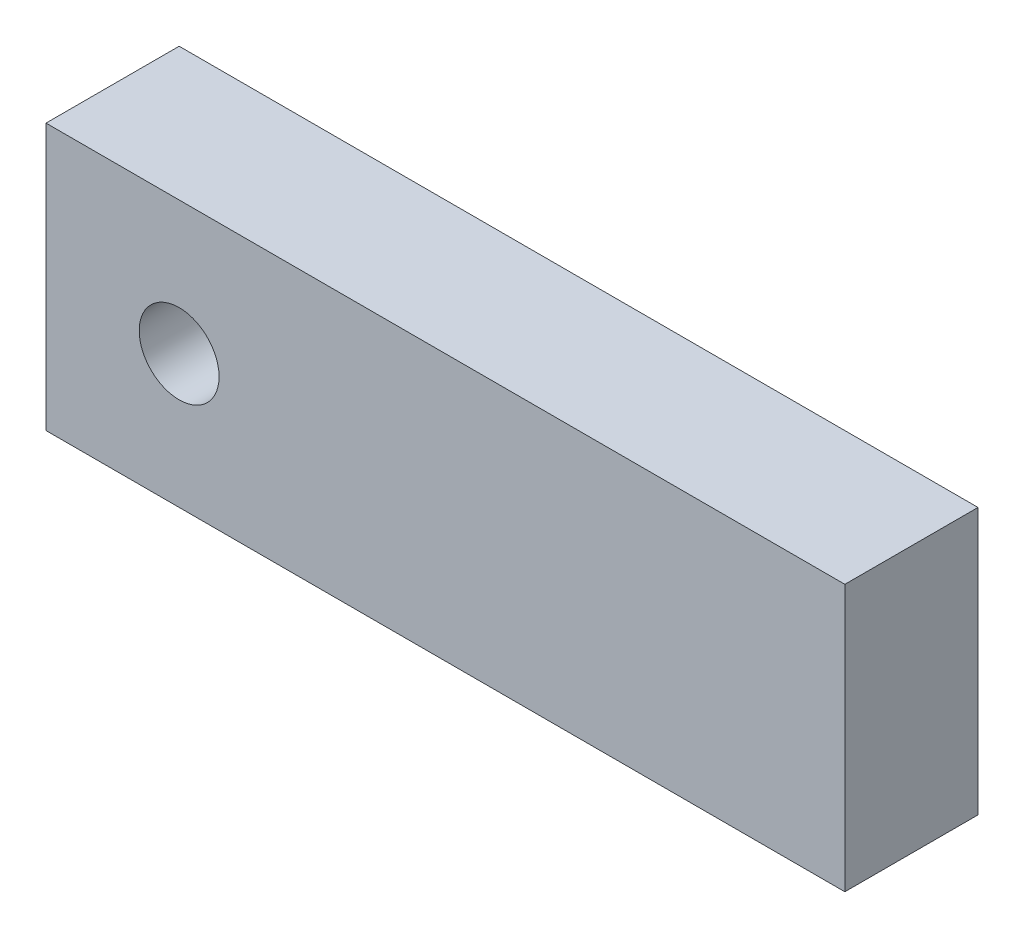
ISO-10303-21;
HEADER;
FILE_DESCRIPTION(('STEP AP214'),'2;1');
FILE_NAME('part.step','',(''),(''),'','','');
FILE_SCHEMA(('AUTOMOTIVE_DESIGN { 1 0 10303 214 1 1 1 1 }'));
ENDSEC;
DATA;
#1=APPLICATION_CONTEXT('core data for automotive mechanical design processes');
#2=APPLICATION_PROTOCOL_DEFINITION('international standard','automotive_design',2000,#1);
#3=PRODUCT_CONTEXT('',#1,'mechanical');
#4=PRODUCT('Part','Part','',(#3));
#5=PRODUCT_RELATED_PRODUCT_CATEGORY('part','',(#4));
#6=PRODUCT_DEFINITION_FORMATION('','',#4);
#7=PRODUCT_DEFINITION_CONTEXT('part definition',#1,'design');
#8=PRODUCT_DEFINITION('design','',#6,#7);
#9=PRODUCT_DEFINITION_SHAPE('','',#8);
#10=(LENGTH_UNIT() NAMED_UNIT(*) SI_UNIT(.MILLI.,.METRE.));
#11=(NAMED_UNIT(*) PLANE_ANGLE_UNIT() SI_UNIT($,.RADIAN.));
#12=(NAMED_UNIT(*) SI_UNIT($,.STERADIAN.) SOLID_ANGLE_UNIT());
#13=UNCERTAINTY_MEASURE_WITH_UNIT(LENGTH_MEASURE(1.E-05),#10,'distance_accuracy_value','');
#14=(GEOMETRIC_REPRESENTATION_CONTEXT(3) GLOBAL_UNCERTAINTY_ASSIGNED_CONTEXT((#13)) GLOBAL_UNIT_ASSIGNED_CONTEXT((#10,
#11,#12)) REPRESENTATION_CONTEXT('',''));
#15=CARTESIAN_POINT('',(0.,0.,0.));
#16=DIRECTION('',(0.,0.,1.));
#17=DIRECTION('',(1.,0.,0.));
#18=AXIS2_PLACEMENT_3D('',#15,#16,#17);
#19=CARTESIAN_POINT('',(15.,5.,5.));
#20=DIRECTION('',(-1.,0.,0.));
#21=DIRECTION('',(0.,-1.,0.));
#22=AXIS2_PLACEMENT_3D('',#19,#20,#21);
#23=PLANE('',#22);
#24=DIRECTION('',(0.,1.,0.));
#25=VECTOR('',#24,1.);
#26=CARTESIAN_POINT('',(15.,5.,0.));
#27=LINE('',#26,#25);
#28=CARTESIAN_POINT('',(15.,-5.,0.));
#29=VERTEX_POINT('',#28);
#30=CARTESIAN_POINT('',(15.,5.,0.));
#31=VERTEX_POINT('',#30);
#32=EDGE_CURVE('E94',#29,#31,#27,.T.);
#33=ORIENTED_EDGE('',*,*,#32,.T.);
#34=DIRECTION('',(0.,0.,-1.));
#35=VECTOR('',#34,1.);
#36=CARTESIAN_POINT('',(15.,5.,5.));
#37=LINE('',#36,#35);
#38=CARTESIAN_POINT('',(15.,5.,5.));
#39=VERTEX_POINT('',#38);
#40=EDGE_CURVE('E11',#39,#31,#37,.T.);
#41=ORIENTED_EDGE('',*,*,#40,.F.);
#42=DIRECTION('',(0.,1.,0.));
#43=VECTOR('',#42,1.);
#44=CARTESIAN_POINT('',(15.,5.,5.));
#45=LINE('',#44,#43);
#46=CARTESIAN_POINT('',(15.,-5.,5.));
#47=VERTEX_POINT('',#46);
#48=EDGE_CURVE('E82',#47,#39,#45,.T.);
#49=ORIENTED_EDGE('',*,*,#48,.F.);
#50=DIRECTION('',(0.,0.,-1.));
#51=VECTOR('',#50,1.);
#52=CARTESIAN_POINT('',(15.,-5.,5.));
#53=LINE('',#52,#51);
#54=EDGE_CURVE('E90',#47,#29,#53,.T.);
#55=ORIENTED_EDGE('',*,*,#54,.T.);
#56=EDGE_LOOP('',(#33,#41,#49,#55));
#57=FACE_BOUND('',#56,.T.);
#58=ADVANCED_FACE('F31',(#57),#23,.F.);
#59=CARTESIAN_POINT('',(-15.,5.,5.));
#60=DIRECTION('',(0.,-1.,0.));
#61=DIRECTION('',(0.,0.,-1.));
#62=AXIS2_PLACEMENT_3D('',#59,#60,#61);
#63=PLANE('',#62);
#64=DIRECTION('',(-1.,0.,0.));
#65=VECTOR('',#64,1.);
#66=CARTESIAN_POINT('',(-15.,5.,0.));
#67=LINE('',#66,#65);
#68=CARTESIAN_POINT('',(-15.,5.,0.));
#69=VERTEX_POINT('',#68);
#70=EDGE_CURVE('E86',#31,#69,#67,.T.);
#71=ORIENTED_EDGE('',*,*,#70,.T.);
#72=DIRECTION('',(0.,0.,-1.));
#73=VECTOR('',#72,1.);
#74=CARTESIAN_POINT('',(-15.,5.,5.));
#75=LINE('',#74,#73);
#76=CARTESIAN_POINT('',(-15.,5.,5.));
#77=VERTEX_POINT('',#76);
#78=EDGE_CURVE('E39',#77,#69,#75,.T.);
#79=ORIENTED_EDGE('',*,*,#78,.F.);
#80=DIRECTION('',(-1.,0.,0.));
#81=VECTOR('',#80,1.);
#82=CARTESIAN_POINT('',(-15.,5.,5.));
#83=LINE('',#82,#81);
#84=EDGE_CURVE('E77',#39,#77,#83,.T.);
#85=ORIENTED_EDGE('',*,*,#84,.F.);
#86=ORIENTED_EDGE('',*,*,#40,.T.);
#87=EDGE_LOOP('',(#71,#79,#85,#86));
#88=FACE_BOUND('',#87,.T.);
#89=ADVANCED_FACE('F85',(#88),#63,.F.);
#90=CARTESIAN_POINT('',(-15.,5.,5.));
#91=DIRECTION('',(1.,0.,0.));
#92=DIRECTION('',(0.,1.,0.));
#93=AXIS2_PLACEMENT_3D('',#90,#91,#92);
#94=PLANE('',#93);
#95=DIRECTION('',(0.,-1.,0.));
#96=VECTOR('',#95,1.);
#97=CARTESIAN_POINT('',(-15.,5.,0.));
#98=LINE('',#97,#96);
#99=CARTESIAN_POINT('',(-15.,-5.,0.));
#100=VERTEX_POINT('',#99);
#101=EDGE_CURVE('E64',#69,#100,#98,.T.);
#102=ORIENTED_EDGE('',*,*,#101,.T.);
#103=DIRECTION('',(0.,0.,-1.));
#104=VECTOR('',#103,1.);
#105=CARTESIAN_POINT('',(-15.,-5.,5.));
#106=LINE('',#105,#104);
#107=CARTESIAN_POINT('',(-15.,-5.,5.));
#108=VERTEX_POINT('',#107);
#109=EDGE_CURVE('E87',#108,#100,#106,.T.);
#110=ORIENTED_EDGE('',*,*,#109,.F.);
#111=DIRECTION('',(0.,-1.,0.));
#112=VECTOR('',#111,1.);
#113=CARTESIAN_POINT('',(-15.,5.,5.));
#114=LINE('',#113,#112);
#115=EDGE_CURVE('E80',#77,#108,#114,.T.);
#116=ORIENTED_EDGE('',*,*,#115,.F.);
#117=ORIENTED_EDGE('',*,*,#78,.T.);
#118=EDGE_LOOP('',(#102,#110,#116,#117));
#119=FACE_BOUND('',#118,.T.);
#120=ADVANCED_FACE('F88',(#119),#94,.F.);
#121=CARTESIAN_POINT('',(-15.,-5.,5.));
#122=DIRECTION('',(0.,1.,0.));
#123=DIRECTION('',(0.,0.,1.));
#124=AXIS2_PLACEMENT_3D('',#121,#122,#123);
#125=PLANE('',#124);
#126=DIRECTION('',(1.,0.,0.));
#127=VECTOR('',#126,1.);
#128=CARTESIAN_POINT('',(-15.,-5.,0.));
#129=LINE('',#128,#127);
#130=EDGE_CURVE('E70',#100,#29,#129,.T.);
#131=ORIENTED_EDGE('',*,*,#130,.T.);
#132=ORIENTED_EDGE('',*,*,#54,.F.);
#133=DIRECTION('',(1.,0.,0.));
#134=VECTOR('',#133,1.);
#135=CARTESIAN_POINT('',(-15.,-5.,5.));
#136=LINE('',#135,#134);
#137=EDGE_CURVE('E47',#108,#47,#136,.T.);
#138=ORIENTED_EDGE('',*,*,#137,.F.);
#139=ORIENTED_EDGE('',*,*,#109,.T.);
#140=EDGE_LOOP('',(#131,#132,#138,#139));
#141=FACE_BOUND('',#140,.T.);
#142=ADVANCED_FACE('F102',(#141),#125,.F.);
#143=CARTESIAN_POINT('',(15.,-5.,5.));
#144=DIRECTION('',(0.,0.,1.));
#145=DIRECTION('',(1.,0.,0.));
#146=AXIS2_PLACEMENT_3D('',#143,#144,#145);
#147=PLANE('',#146);
#148=CARTESIAN_POINT('',(-10.,0.,5.));
#149=DIRECTION('',(0.,0.,1.));
#150=DIRECTION('',(1.,0.,0.));
#151=AXIS2_PLACEMENT_3D('',#148,#149,#150);
#152=CIRCLE('',#151,1.5);
#153=CARTESIAN_POINT('',(-8.5,0.,5.));
#154=VERTEX_POINT('',#153);
#155=EDGE_CURVE('E108',#154,#154,#152,.T.);
#156=ORIENTED_EDGE('',*,*,#155,.F.);
#157=EDGE_LOOP('',(#156));
#158=FACE_BOUND('',#157,.T.);
#159=ORIENTED_EDGE('',*,*,#48,.T.);
#160=ORIENTED_EDGE('',*,*,#84,.T.);
#161=ORIENTED_EDGE('',*,*,#115,.T.);
#162=ORIENTED_EDGE('',*,*,#137,.T.);
#163=EDGE_LOOP('',(#159,#160,#161,#162));
#164=FACE_BOUND('',#163,.T.);
#165=ADVANCED_FACE('F78',(#158,#164),#147,.T.);
#166=CARTESIAN_POINT('',(15.,-5.,0.));
#167=DIRECTION('',(0.,0.,1.));
#168=DIRECTION('',(1.,0.,0.));
#169=AXIS2_PLACEMENT_3D('',#166,#167,#168);
#170=PLANE('',#169);
#171=CARTESIAN_POINT('',(-10.,0.,0.));
#172=DIRECTION('',(0.,0.,1.));
#173=DIRECTION('',(1.,0.,0.));
#174=AXIS2_PLACEMENT_3D('',#171,#172,#173);
#175=CIRCLE('',#174,1.5);
#176=CARTESIAN_POINT('',(-8.5,0.,0.));
#177=VERTEX_POINT('',#176);
#178=EDGE_CURVE('E97',#177,#177,#175,.T.);
#179=ORIENTED_EDGE('',*,*,#178,.T.);
#180=EDGE_LOOP('',(#179));
#181=FACE_BOUND('',#180,.T.);
#182=ORIENTED_EDGE('',*,*,#32,.F.);
#183=ORIENTED_EDGE('',*,*,#130,.F.);
#184=ORIENTED_EDGE('',*,*,#101,.F.);
#185=ORIENTED_EDGE('',*,*,#70,.F.);
#186=EDGE_LOOP('',(#182,#183,#184,#185));
#187=FACE_BOUND('',#186,.T.);
#188=ADVANCED_FACE('F105',(#181,#187),#170,.F.);
#189=CARTESIAN_POINT('',(-10.,0.,0.));
#190=DIRECTION('',(0.,0.,1.));
#191=DIRECTION('',(1.,0.,0.));
#192=AXIS2_PLACEMENT_3D('',#189,#190,#191);
#193=CYLINDRICAL_SURFACE('',#192,1.5);
#194=ORIENTED_EDGE('',*,*,#178,.F.);
#195=EDGE_LOOP('',(#194));
#196=FACE_BOUND('',#195,.T.);
#197=ORIENTED_EDGE('',*,*,#155,.T.);
#198=EDGE_LOOP('',(#197));
#199=FACE_BOUND('',#198,.T.);
#200=ADVANCED_FACE('F115',(#196,#199),#193,.F.);
#201=CLOSED_SHELL('',(#58,#89,#120,#142,#165,#188,#200));
#202=MANIFOLD_SOLID_BREP('B2',#201);
#203=ADVANCED_BREP_SHAPE_REPRESENTATION('',(#18,#202),#14);
#204=SHAPE_DEFINITION_REPRESENTATION(#9,#203);
ENDSEC;
END-ISO-10303-21;
